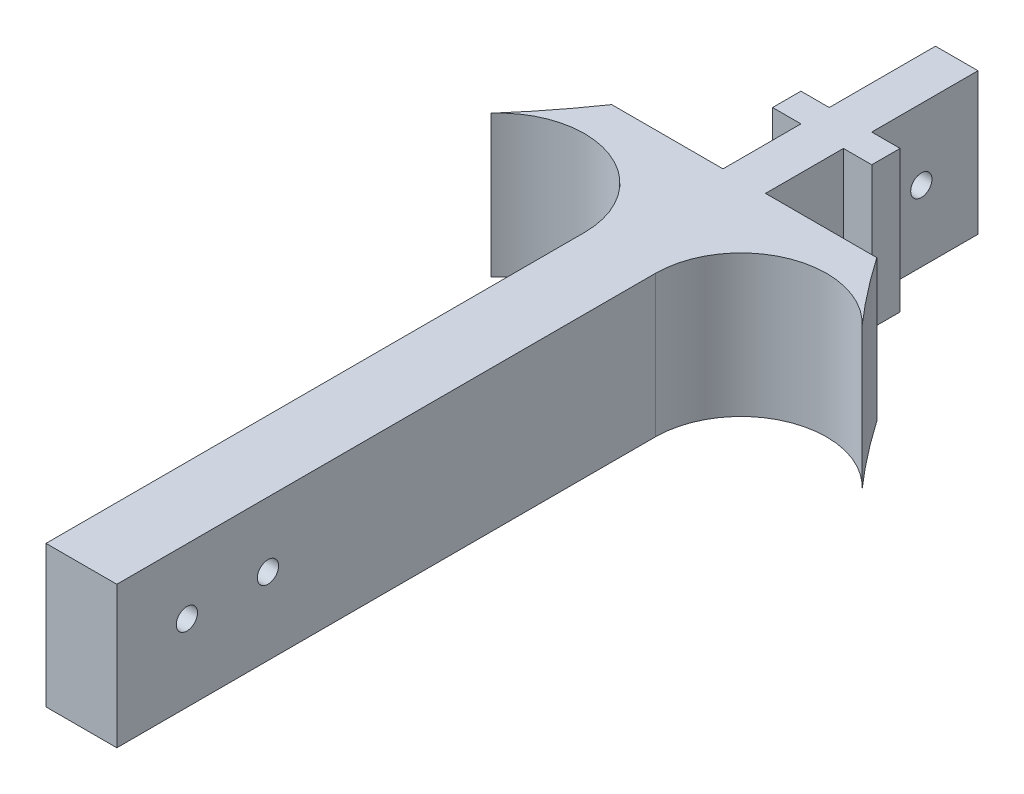
ISO-10303-21;
HEADER;
FILE_DESCRIPTION(('STEP AP214'),'2;1');
FILE_NAME('part.step','',(''),(''),'','','');
FILE_SCHEMA(('AUTOMOTIVE_DESIGN { 1 0 10303 214 1 1 1 1 }'));
ENDSEC;
DATA;
#1=APPLICATION_CONTEXT('core data for automotive mechanical design processes');
#2=APPLICATION_PROTOCOL_DEFINITION('international standard','automotive_design',2000,#1);
#3=PRODUCT_CONTEXT('',#1,'mechanical');
#4=PRODUCT('Part','Part','',(#3));
#5=PRODUCT_RELATED_PRODUCT_CATEGORY('part','',(#4));
#6=PRODUCT_DEFINITION_FORMATION('','',#4);
#7=PRODUCT_DEFINITION_CONTEXT('part definition',#1,'design');
#8=PRODUCT_DEFINITION('design','',#6,#7);
#9=PRODUCT_DEFINITION_SHAPE('','',#8);
#10=(LENGTH_UNIT() NAMED_UNIT(*) SI_UNIT(.MILLI.,.METRE.));
#11=(NAMED_UNIT(*) PLANE_ANGLE_UNIT() SI_UNIT($,.RADIAN.));
#12=(NAMED_UNIT(*) SI_UNIT($,.STERADIAN.) SOLID_ANGLE_UNIT());
#13=UNCERTAINTY_MEASURE_WITH_UNIT(LENGTH_MEASURE(1.E-05),#10,'distance_accuracy_value','');
#14=(GEOMETRIC_REPRESENTATION_CONTEXT(3) GLOBAL_UNCERTAINTY_ASSIGNED_CONTEXT((#13)) GLOBAL_UNIT_ASSIGNED_CONTEXT((#10,
#11,#12)) REPRESENTATION_CONTEXT('',''));
#15=CARTESIAN_POINT('',(0.,0.,0.));
#16=DIRECTION('',(0.,0.,1.));
#17=DIRECTION('',(1.,0.,0.));
#18=AXIS2_PLACEMENT_3D('',#15,#16,#17);
#19=CARTESIAN_POINT('',(-3.,20.,-84.398281038144));
#20=DIRECTION('',(0.,0.,1.));
#21=DIRECTION('',(1.,0.,0.));
#22=AXIS2_PLACEMENT_3D('',#19,#20,#21);
#23=PLANE('',#22);
#24=DIRECTION('',(-1.,0.,0.));
#25=VECTOR('',#24,1.);
#26=CARTESIAN_POINT('',(-3.,0.,-84.398281038144));
#27=LINE('',#26,#25);
#28=CARTESIAN_POINT('',(3.,0.,-84.398281038144));
#29=VERTEX_POINT('',#28);
#30=CARTESIAN_POINT('',(-3.,0.,-84.398281038144));
#31=VERTEX_POINT('',#30);
#32=EDGE_CURVE('E148',#29,#31,#27,.T.);
#33=ORIENTED_EDGE('',*,*,#32,.T.);
#34=DIRECTION('',(0.,-1.,0.));
#35=VECTOR('',#34,1.);
#36=CARTESIAN_POINT('',(-3.,20.,-84.398281038144));
#37=LINE('',#36,#35);
#38=CARTESIAN_POINT('',(-3.,20.,-84.398281038144));
#39=VERTEX_POINT('',#38);
#40=EDGE_CURVE('E11',#39,#31,#37,.T.);
#41=ORIENTED_EDGE('',*,*,#40,.F.);
#42=DIRECTION('',(-1.,0.,0.));
#43=VECTOR('',#42,1.);
#44=CARTESIAN_POINT('',(-3.,20.,-84.398281038144));
#45=LINE('',#44,#43);
#46=CARTESIAN_POINT('',(3.,20.,-84.398281038144));
#47=VERTEX_POINT('',#46);
#48=EDGE_CURVE('E170',#47,#39,#45,.T.);
#49=ORIENTED_EDGE('',*,*,#48,.F.);
#50=DIRECTION('',(0.,-1.,0.));
#51=VECTOR('',#50,1.);
#52=CARTESIAN_POINT('',(3.,20.,-84.398281038144));
#53=LINE('',#52,#51);
#54=EDGE_CURVE('E232',#47,#29,#53,.T.);
#55=ORIENTED_EDGE('',*,*,#54,.T.);
#56=EDGE_LOOP('',(#33,#41,#49,#55));
#57=FACE_BOUND('',#56,.T.);
#58=ADVANCED_FACE('F31',(#57),#23,.F.);
#59=CARTESIAN_POINT('',(-3.,20.,-84.398281038144));
#60=DIRECTION('',(1.,0.,0.));
#61=DIRECTION('',(0.,0.,-1.));
#62=AXIS2_PLACEMENT_3D('',#59,#60,#61);
#63=PLANE('',#62);
#64=CARTESIAN_POINT('',(-3.,10.,-76.398281038144));
#65=DIRECTION('',(-1.,0.,0.));
#66=DIRECTION('',(0.,0.,1.));
#67=AXIS2_PLACEMENT_3D('',#64,#65,#66);
#68=CIRCLE('',#67,1.5);
#69=CARTESIAN_POINT('',(-3.,10.,-74.898281038144));
#70=VERTEX_POINT('',#69);
#71=EDGE_CURVE('E190',#70,#70,#68,.T.);
#72=ORIENTED_EDGE('',*,*,#71,.F.);
#73=EDGE_LOOP('',(#72));
#74=FACE_BOUND('',#73,.T.);
#75=DIRECTION('',(0.,0.,1.));
#76=VECTOR('',#75,1.);
#77=CARTESIAN_POINT('',(-3.,0.,-84.398281038144));
#78=LINE('',#77,#76);
#79=CARTESIAN_POINT('',(-3.,0.,-69.398281038144));
#80=VERTEX_POINT('',#79);
#81=EDGE_CURVE('E151',#31,#80,#78,.T.);
#82=ORIENTED_EDGE('',*,*,#81,.T.);
#83=DIRECTION('',(0.,-1.,0.));
#84=VECTOR('',#83,1.);
#85=CARTESIAN_POINT('',(-3.,20.,-69.398281038144));
#86=LINE('',#85,#84);
#87=CARTESIAN_POINT('',(-3.,20.,-69.398281038144));
#88=VERTEX_POINT('',#87);
#89=EDGE_CURVE('E40',#88,#80,#86,.T.);
#90=ORIENTED_EDGE('',*,*,#89,.F.);
#91=DIRECTION('',(0.,0.,1.));
#92=VECTOR('',#91,1.);
#93=CARTESIAN_POINT('',(-3.,20.,-84.398281038144));
#94=LINE('',#93,#92);
#95=EDGE_CURVE('E99',#39,#88,#94,.T.);
#96=ORIENTED_EDGE('',*,*,#95,.F.);
#97=ORIENTED_EDGE('',*,*,#40,.T.);
#98=EDGE_LOOP('',(#82,#90,#96,#97));
#99=FACE_BOUND('',#98,.T.);
#100=ADVANCED_FACE('F376',(#74,#99),#63,.F.);
#101=CARTESIAN_POINT('',(-3.,20.,-69.398281038144));
#102=DIRECTION('',(0.,0.,1.));
#103=DIRECTION('',(1.,0.,0.));
#104=AXIS2_PLACEMENT_3D('',#101,#102,#103);
#105=PLANE('',#104);
#106=DIRECTION('',(-1.,0.,0.));
#107=VECTOR('',#106,1.);
#108=CARTESIAN_POINT('',(-3.,0.,-69.398281038144));
#109=LINE('',#108,#107);
#110=CARTESIAN_POINT('',(-7.,0.,-69.398281038144));
#111=VERTEX_POINT('',#110);
#112=EDGE_CURVE('E154',#80,#111,#109,.T.);
#113=ORIENTED_EDGE('',*,*,#112,.T.);
#114=DIRECTION('',(0.,-1.,0.));
#115=VECTOR('',#114,1.);
#116=CARTESIAN_POINT('',(-7.,20.,-69.398281038144));
#117=LINE('',#116,#115);
#118=CARTESIAN_POINT('',(-7.,20.,-69.398281038144));
#119=VERTEX_POINT('',#118);
#120=EDGE_CURVE('E183',#119,#111,#117,.T.);
#121=ORIENTED_EDGE('',*,*,#120,.F.);
#122=DIRECTION('',(-1.,0.,0.));
#123=VECTOR('',#122,1.);
#124=CARTESIAN_POINT('',(-3.,20.,-69.398281038144));
#125=LINE('',#124,#123);
#126=EDGE_CURVE('E286',#88,#119,#125,.T.);
#127=ORIENTED_EDGE('',*,*,#126,.F.);
#128=ORIENTED_EDGE('',*,*,#89,.T.);
#129=EDGE_LOOP('',(#113,#121,#127,#128));
#130=FACE_BOUND('',#129,.T.);
#131=ADVANCED_FACE('F380',(#130),#105,.F.);
#132=CARTESIAN_POINT('',(-7.,20.,-69.398281038144));
#133=DIRECTION('',(1.,0.,0.));
#134=DIRECTION('',(0.,0.,-1.));
#135=AXIS2_PLACEMENT_3D('',#132,#133,#134);
#136=PLANE('',#135);
#137=DIRECTION('',(0.,0.,1.));
#138=VECTOR('',#137,1.);
#139=CARTESIAN_POINT('',(-7.,0.,-69.398281038144));
#140=LINE('',#139,#138);
#141=CARTESIAN_POINT('',(-7.,0.,-65.398281038144));
#142=VERTEX_POINT('',#141);
#143=EDGE_CURVE('E156',#111,#142,#140,.T.);
#144=ORIENTED_EDGE('',*,*,#143,.T.);
#145=DIRECTION('',(0.,-1.,0.));
#146=VECTOR('',#145,1.);
#147=CARTESIAN_POINT('',(-7.,20.,-65.398281038144));
#148=LINE('',#147,#146);
#149=CARTESIAN_POINT('',(-7.,20.,-65.398281038144));
#150=VERTEX_POINT('',#149);
#151=EDGE_CURVE('E180',#150,#142,#148,.T.);
#152=ORIENTED_EDGE('',*,*,#151,.F.);
#153=DIRECTION('',(0.,0.,1.));
#154=VECTOR('',#153,1.);
#155=CARTESIAN_POINT('',(-7.,20.,-69.398281038144));
#156=LINE('',#155,#154);
#157=EDGE_CURVE('E288',#119,#150,#156,.T.);
#158=ORIENTED_EDGE('',*,*,#157,.F.);
#159=ORIENTED_EDGE('',*,*,#120,.T.);
#160=EDGE_LOOP('',(#144,#152,#158,#159));
#161=FACE_BOUND('',#160,.T.);
#162=ADVANCED_FACE('F385',(#161),#136,.F.);
#163=CARTESIAN_POINT('',(-3.,20.,-65.398281038144));
#164=DIRECTION('',(0.,0.,-1.));
#165=DIRECTION('',(-1.,0.,0.));
#166=AXIS2_PLACEMENT_3D('',#163,#164,#165);
#167=PLANE('',#166);
#168=DIRECTION('',(1.,0.,0.));
#169=VECTOR('',#168,1.);
#170=CARTESIAN_POINT('',(-3.,0.,-65.398281038144));
#171=LINE('',#170,#169);
#172=CARTESIAN_POINT('',(-3.,0.,-65.398281038144));
#173=VERTEX_POINT('',#172);
#174=EDGE_CURVE('E158',#142,#173,#171,.T.);
#175=ORIENTED_EDGE('',*,*,#174,.T.);
#176=DIRECTION('',(0.,-1.,0.));
#177=VECTOR('',#176,1.);
#178=CARTESIAN_POINT('',(-3.,20.,-65.398281038144));
#179=LINE('',#178,#177);
#180=CARTESIAN_POINT('',(-3.,20.,-65.398281038144));
#181=VERTEX_POINT('',#180);
#182=EDGE_CURVE('E177',#181,#173,#179,.T.);
#183=ORIENTED_EDGE('',*,*,#182,.F.);
#184=DIRECTION('',(1.,0.,0.));
#185=VECTOR('',#184,1.);
#186=CARTESIAN_POINT('',(-3.,20.,-65.398281038144));
#187=LINE('',#186,#185);
#188=EDGE_CURVE('E290',#150,#181,#187,.T.);
#189=ORIENTED_EDGE('',*,*,#188,.F.);
#190=ORIENTED_EDGE('',*,*,#151,.T.);
#191=EDGE_LOOP('',(#175,#183,#189,#190));
#192=FACE_BOUND('',#191,.T.);
#193=ADVANCED_FACE('F391',(#192),#167,.F.);
#194=CARTESIAN_POINT('',(-3.,20.,-65.398281038144));
#195=DIRECTION('',(1.,0.,0.));
#196=DIRECTION('',(0.,0.,-1.));
#197=AXIS2_PLACEMENT_3D('',#194,#195,#196);
#198=PLANE('',#197);
#199=CARTESIAN_POINT('',(-3.,10.,-60.398281038144));
#200=DIRECTION('',(-1.,0.,0.));
#201=DIRECTION('',(0.,0.,1.));
#202=AXIS2_PLACEMENT_3D('',#199,#200,#201);
#203=CIRCLE('',#202,1.5);
#204=CARTESIAN_POINT('',(-3.,10.,-58.898281038144));
#205=VERTEX_POINT('',#204);
#206=EDGE_CURVE('E201',#205,#205,#203,.T.);
#207=ORIENTED_EDGE('',*,*,#206,.F.);
#208=EDGE_LOOP('',(#207));
#209=FACE_BOUND('',#208,.T.);
#210=DIRECTION('',(0.,0.,1.));
#211=VECTOR('',#210,1.);
#212=CARTESIAN_POINT('',(-3.,0.,-65.398281038144));
#213=LINE('',#212,#211);
#214=CARTESIAN_POINT('',(-3.,0.,-54.398281038144));
#215=VERTEX_POINT('',#214);
#216=EDGE_CURVE('E160',#173,#215,#213,.T.);
#217=ORIENTED_EDGE('',*,*,#216,.T.);
#218=DIRECTION('',(0.,-1.,0.));
#219=VECTOR('',#218,1.);
#220=CARTESIAN_POINT('',(-3.,20.,-54.398281038144));
#221=LINE('',#220,#219);
#222=CARTESIAN_POINT('',(-3.,20.,-54.398281038144));
#223=VERTEX_POINT('',#222);
#224=EDGE_CURVE('E174',#223,#215,#221,.T.);
#225=ORIENTED_EDGE('',*,*,#224,.F.);
#226=DIRECTION('',(0.,0.,1.));
#227=VECTOR('',#226,1.);
#228=CARTESIAN_POINT('',(-3.,20.,-65.398281038144));
#229=LINE('',#228,#227);
#230=EDGE_CURVE('E292',#181,#223,#229,.T.);
#231=ORIENTED_EDGE('',*,*,#230,.F.);
#232=ORIENTED_EDGE('',*,*,#182,.T.);
#233=EDGE_LOOP('',(#217,#225,#231,#232));
#234=FACE_BOUND('',#233,.T.);
#235=ADVANCED_FACE('F298',(#209,#234),#198,.F.);
#236=CARTESIAN_POINT('',(-3.,20.,-54.398281038144));
#237=DIRECTION('',(0.,0.,1.));
#238=DIRECTION('',(1.,0.,0.));
#239=AXIS2_PLACEMENT_3D('',#236,#237,#238);
#240=PLANE('',#239);
#241=DIRECTION('',(-1.,0.,0.));
#242=VECTOR('',#241,1.);
#243=CARTESIAN_POINT('',(-3.,0.,-54.398281038144));
#244=LINE('',#243,#242);
#245=CARTESIAN_POINT('',(-18.71,0.,-54.398281038144));
#246=VERTEX_POINT('',#245);
#247=EDGE_CURVE('E162',#215,#246,#244,.T.);
#248=ORIENTED_EDGE('',*,*,#247,.T.);
#249=DIRECTION('',(0.,-1.,0.));
#250=VECTOR('',#249,1.);
#251=CARTESIAN_POINT('',(-18.71,20.,-54.398281038144));
#252=LINE('',#251,#250);
#253=CARTESIAN_POINT('',(-18.71,20.,-54.398281038144));
#254=VERTEX_POINT('',#253);
#255=EDGE_CURVE('E137',#254,#246,#252,.T.);
#256=ORIENTED_EDGE('',*,*,#255,.F.);
#257=DIRECTION('',(-1.,0.,0.));
#258=VECTOR('',#257,1.);
#259=CARTESIAN_POINT('',(-3.,20.,-54.398281038144));
#260=LINE('',#259,#258);
#261=EDGE_CURVE('E128',#223,#254,#260,.T.);
#262=ORIENTED_EDGE('',*,*,#261,.F.);
#263=ORIENTED_EDGE('',*,*,#224,.T.);
#264=EDGE_LOOP('',(#248,#256,#262,#263));
#265=FACE_BOUND('',#264,.T.);
#266=ADVANCED_FACE('F302',(#265),#240,.F.);
#267=CARTESIAN_POINT('',(-105.5,20.,-114.379493930182));
#268=DIRECTION('',(0.,-1.,0.));
#269=DIRECTION('',(0.,0.,-1.));
#270=AXIS2_PLACEMENT_3D('',#267,#268,#269);
#271=CYLINDRICAL_SURFACE('',#270,105.5);
#272=CARTESIAN_POINT('',(-105.5,0.,-114.379493930182));
#273=DIRECTION('',(0.,-1.,0.));
#274=DIRECTION('',(0.,0.,1.));
#275=AXIS2_PLACEMENT_3D('',#272,#273,#274);
#276=CIRCLE('',#275,105.5);
#277=CARTESIAN_POINT('',(-26.1833299524756,0.,-44.8157400595625));
#278=VERTEX_POINT('',#277);
#279=EDGE_CURVE('E136',#246,#278,#276,.T.);
#280=ORIENTED_EDGE('',*,*,#279,.T.);
#281=DIRECTION('',(0.,-1.,0.));
#282=VECTOR('',#281,1.);
#283=CARTESIAN_POINT('',(-26.1833299524756,20.,-44.8157400595625));
#284=LINE('',#283,#282);
#285=CARTESIAN_POINT('',(-26.1833299524756,20.,-44.8157400595625));
#286=VERTEX_POINT('',#285);
#287=EDGE_CURVE('E133',#286,#278,#284,.T.);
#288=ORIENTED_EDGE('',*,*,#287,.F.);
#289=CARTESIAN_POINT('',(-105.5,20.,-114.379493930182));
#290=DIRECTION('',(0.,-1.,0.));
#291=DIRECTION('',(0.,0.,1.));
#292=AXIS2_PLACEMENT_3D('',#289,#290,#291);
#293=CIRCLE('',#292,105.5);
#294=EDGE_CURVE('E122',#254,#286,#293,.T.);
#295=ORIENTED_EDGE('',*,*,#294,.F.);
#296=ORIENTED_EDGE('',*,*,#255,.T.);
#297=EDGE_LOOP('',(#280,#288,#295,#296));
#298=FACE_BOUND('',#297,.T.);
#299=ADVANCED_FACE('F134',(#298),#271,.F.);
#300=CARTESIAN_POINT('',(-17.0922063437865,20.,-36.8424768761321));
#301=DIRECTION('',(0.,-1.,0.));
#302=DIRECTION('',(0.,0.,-1.));
#303=AXIS2_PLACEMENT_3D('',#300,#301,#302);
#304=CYLINDRICAL_SURFACE('',#303,12.0922063437865);
#305=CARTESIAN_POINT('',(-17.0922063437865,0.,-36.8424768761321));
#306=DIRECTION('',(0.,-1.,0.));
#307=DIRECTION('',(0.,0.,1.));
#308=AXIS2_PLACEMENT_3D('',#305,#306,#307);
#309=CIRCLE('',#308,12.0922063437865);
#310=CARTESIAN_POINT('',(-4.99999999999998,0.,-36.8424768761321));
#311=VERTEX_POINT('',#310);
#312=EDGE_CURVE('E85',#278,#311,#309,.T.);
#313=ORIENTED_EDGE('',*,*,#312,.T.);
#314=DIRECTION('',(0.,-1.,0.));
#315=VECTOR('',#314,1.);
#316=CARTESIAN_POINT('',(-4.99999999999998,20.,-36.8424768761321));
#317=LINE('',#316,#315);
#318=CARTESIAN_POINT('',(-4.99999999999998,20.,-36.8424768761321));
#319=VERTEX_POINT('',#318);
#320=EDGE_CURVE('E138',#319,#311,#317,.T.);
#321=ORIENTED_EDGE('',*,*,#320,.F.);
#322=CARTESIAN_POINT('',(-17.0922063437865,20.,-36.8424768761321));
#323=DIRECTION('',(0.,-1.,0.));
#324=DIRECTION('',(0.,0.,1.));
#325=AXIS2_PLACEMENT_3D('',#322,#323,#324);
#326=CIRCLE('',#325,12.0922063437865);
#327=EDGE_CURVE('E126',#286,#319,#326,.T.);
#328=ORIENTED_EDGE('',*,*,#327,.F.);
#329=ORIENTED_EDGE('',*,*,#287,.T.);
#330=EDGE_LOOP('',(#313,#321,#328,#329));
#331=FACE_BOUND('',#330,.T.);
#332=ADVANCED_FACE('F140',(#331),#304,.F.);
#333=CARTESIAN_POINT('',(-4.99999999999998,20.,-36.8424768761321));
#334=DIRECTION('',(1.,0.,0.));
#335=DIRECTION('',(0.,0.,-1.));
#336=AXIS2_PLACEMENT_3D('',#333,#334,#335);
#337=PLANE('',#336);
#338=CARTESIAN_POINT('',(-4.99999999999999,10.84,17.8419758746343));
#339=DIRECTION('',(-1.,0.,0.));
#340=DIRECTION('',(0.,0.,1.));
#341=AXIS2_PLACEMENT_3D('',#338,#339,#340);
#342=CIRCLE('',#341,1.5);
#343=CARTESIAN_POINT('',(-4.99999999999999,10.84,19.3419758746343));
#344=VERTEX_POINT('',#343);
#345=EDGE_CURVE('E563',#344,#344,#342,.T.);
#346=ORIENTED_EDGE('',*,*,#345,.F.);
#347=EDGE_LOOP('',(#346));
#348=FACE_BOUND('',#347,.T.);
#349=CARTESIAN_POINT('',(-4.99999999999999,10.84,29.2919758746343));
#350=DIRECTION('',(-1.,0.,0.));
#351=DIRECTION('',(0.,0.,1.));
#352=AXIS2_PLACEMENT_3D('',#349,#350,#351);
#353=CIRCLE('',#352,1.5);
#354=CARTESIAN_POINT('',(-4.99999999999999,10.84,30.7919758746343));
#355=VERTEX_POINT('',#354);
#356=EDGE_CURVE('E565',#355,#355,#353,.T.);
#357=ORIENTED_EDGE('',*,*,#356,.F.);
#358=EDGE_LOOP('',(#357));
#359=FACE_BOUND('',#358,.T.);
#360=DIRECTION('',(0.,0.,1.));
#361=VECTOR('',#360,1.);
#362=CARTESIAN_POINT('',(-4.99999999999998,0.,-36.8424768761321));
#363=LINE('',#362,#361);
#364=CARTESIAN_POINT('',(-4.99999999999998,0.,39.1827395865434));
#365=VERTEX_POINT('',#364);
#366=EDGE_CURVE('E91',#311,#365,#363,.T.);
#367=ORIENTED_EDGE('',*,*,#366,.T.);
#368=DIRECTION('',(0.,-1.,0.));
#369=VECTOR('',#368,1.);
#370=CARTESIAN_POINT('',(-4.99999999999998,20.,39.1827395865434));
#371=LINE('',#370,#369);
#372=CARTESIAN_POINT('',(-4.99999999999998,20.,39.1827395865434));
#373=VERTEX_POINT('',#372);
#374=EDGE_CURVE('E147',#373,#365,#371,.T.);
#375=ORIENTED_EDGE('',*,*,#374,.F.);
#376=DIRECTION('',(0.,0.,1.));
#377=VECTOR('',#376,1.);
#378=CARTESIAN_POINT('',(-4.99999999999998,20.,-36.8424768761321));
#379=LINE('',#378,#377);
#380=EDGE_CURVE('E49',#319,#373,#379,.T.);
#381=ORIENTED_EDGE('',*,*,#380,.F.);
#382=ORIENTED_EDGE('',*,*,#320,.T.);
#383=EDGE_LOOP('',(#367,#375,#381,#382));
#384=FACE_BOUND('',#383,.T.);
#385=ADVANCED_FACE('F405',(#348,#359,#384),#337,.F.);
#386=CARTESIAN_POINT('',(-4.99999999999998,20.,39.1827395865434));
#387=DIRECTION('',(0.,0.,-1.));
#388=DIRECTION('',(-1.,0.,0.));
#389=AXIS2_PLACEMENT_3D('',#386,#387,#388);
#390=PLANE('',#389);
#391=DIRECTION('',(1.,0.,0.));
#392=VECTOR('',#391,1.);
#393=CARTESIAN_POINT('',(-4.99999999999998,0.,39.1827395865434));
#394=LINE('',#393,#392);
#395=CARTESIAN_POINT('',(4.99999999999998,0.,39.1827395865434));
#396=VERTEX_POINT('',#395);
#397=EDGE_CURVE('E167',#365,#396,#394,.T.);
#398=ORIENTED_EDGE('',*,*,#397,.T.);
#399=DIRECTION('',(0.,-1.,0.));
#400=VECTOR('',#399,1.);
#401=CARTESIAN_POINT('',(4.99999999999998,20.,39.1827395865434));
#402=LINE('',#401,#400);
#403=CARTESIAN_POINT('',(4.99999999999998,20.,39.1827395865434));
#404=VERTEX_POINT('',#403);
#405=EDGE_CURVE('E152',#404,#396,#402,.T.);
#406=ORIENTED_EDGE('',*,*,#405,.F.);
#407=DIRECTION('',(1.,0.,0.));
#408=VECTOR('',#407,1.);
#409=CARTESIAN_POINT('',(-4.99999999999998,20.,39.1827395865434));
#410=LINE('',#409,#408);
#411=EDGE_CURVE('E142',#373,#404,#410,.T.);
#412=ORIENTED_EDGE('',*,*,#411,.F.);
#413=ORIENTED_EDGE('',*,*,#374,.T.);
#414=EDGE_LOOP('',(#398,#406,#412,#413));
#415=FACE_BOUND('',#414,.T.);
#416=ADVANCED_FACE('F311',(#415),#390,.F.);
#417=CARTESIAN_POINT('',(-17.0922063437865,20.,-36.8424768761321));
#418=DIRECTION('',(0.,1.,0.));
#419=DIRECTION('',(0.,0.,1.));
#420=AXIS2_PLACEMENT_3D('',#417,#418,#419);
#421=PLANE('',#420);
#422=ORIENTED_EDGE('',*,*,#48,.T.);
#423=ORIENTED_EDGE('',*,*,#95,.T.);
#424=ORIENTED_EDGE('',*,*,#126,.T.);
#425=ORIENTED_EDGE('',*,*,#157,.T.);
#426=ORIENTED_EDGE('',*,*,#188,.T.);
#427=ORIENTED_EDGE('',*,*,#230,.T.);
#428=ORIENTED_EDGE('',*,*,#261,.T.);
#429=ORIENTED_EDGE('',*,*,#294,.T.);
#430=ORIENTED_EDGE('',*,*,#327,.T.);
#431=ORIENTED_EDGE('',*,*,#380,.T.);
#432=ORIENTED_EDGE('',*,*,#411,.T.);
#433=DIRECTION('',(0.,0.,1.));
#434=VECTOR('',#433,1.);
#435=CARTESIAN_POINT('',(4.99999999999998,20.,-36.8424768761321));
#436=LINE('',#435,#434);
#437=CARTESIAN_POINT('',(4.99999999999998,20.,-36.8424768761321));
#438=VERTEX_POINT('',#437);
#439=EDGE_CURVE('E205',#438,#404,#436,.T.);
#440=ORIENTED_EDGE('',*,*,#439,.F.);
#441=CARTESIAN_POINT('',(17.0922063437865,20.,-36.8424768761321));
#442=DIRECTION('',(0.,1.,0.));
#443=DIRECTION('',(0.,0.,1.));
#444=AXIS2_PLACEMENT_3D('',#441,#442,#443);
#445=CIRCLE('',#444,12.0922063437865);
#446=CARTESIAN_POINT('',(26.1833299524756,20.,-44.8157400595625));
#447=VERTEX_POINT('',#446);
#448=EDGE_CURVE('E208',#447,#438,#445,.T.);
#449=ORIENTED_EDGE('',*,*,#448,.F.);
#450=CARTESIAN_POINT('',(105.5,20.,-114.379493930182));
#451=DIRECTION('',(0.,1.,0.));
#452=DIRECTION('',(0.,0.,1.));
#453=AXIS2_PLACEMENT_3D('',#450,#451,#452);
#454=CIRCLE('',#453,105.5);
#455=CARTESIAN_POINT('',(18.71,20.,-54.398281038144));
#456=VERTEX_POINT('',#455);
#457=EDGE_CURVE('E212',#456,#447,#454,.T.);
#458=ORIENTED_EDGE('',*,*,#457,.F.);
#459=DIRECTION('',(1.,0.,0.));
#460=VECTOR('',#459,1.);
#461=CARTESIAN_POINT('',(3.,20.,-54.398281038144));
#462=LINE('',#461,#460);
#463=CARTESIAN_POINT('',(3.,20.,-54.398281038144));
#464=VERTEX_POINT('',#463);
#465=EDGE_CURVE('E215',#464,#456,#462,.T.);
#466=ORIENTED_EDGE('',*,*,#465,.F.);
#467=DIRECTION('',(0.,0.,1.));
#468=VECTOR('',#467,1.);
#469=CARTESIAN_POINT('',(3.,20.,-65.398281038144));
#470=LINE('',#469,#468);
#471=CARTESIAN_POINT('',(3.,20.,-65.398281038144));
#472=VERTEX_POINT('',#471);
#473=EDGE_CURVE('E218',#472,#464,#470,.T.);
#474=ORIENTED_EDGE('',*,*,#473,.F.);
#475=DIRECTION('',(-1.,0.,0.));
#476=VECTOR('',#475,1.);
#477=CARTESIAN_POINT('',(3.,20.,-65.398281038144));
#478=LINE('',#477,#476);
#479=CARTESIAN_POINT('',(7.,20.,-65.398281038144));
#480=VERTEX_POINT('',#479);
#481=EDGE_CURVE('E221',#480,#472,#478,.T.);
#482=ORIENTED_EDGE('',*,*,#481,.F.);
#483=DIRECTION('',(0.,0.,1.));
#484=VECTOR('',#483,1.);
#485=CARTESIAN_POINT('',(7.,20.,-69.398281038144));
#486=LINE('',#485,#484);
#487=CARTESIAN_POINT('',(7.,20.,-69.398281038144));
#488=VERTEX_POINT('',#487);
#489=EDGE_CURVE('E224',#488,#480,#486,.T.);
#490=ORIENTED_EDGE('',*,*,#489,.F.);
#491=DIRECTION('',(1.,0.,0.));
#492=VECTOR('',#491,1.);
#493=CARTESIAN_POINT('',(3.,20.,-69.398281038144));
#494=LINE('',#493,#492);
#495=CARTESIAN_POINT('',(3.,20.,-69.398281038144));
#496=VERTEX_POINT('',#495);
#497=EDGE_CURVE('E227',#496,#488,#494,.T.);
#498=ORIENTED_EDGE('',*,*,#497,.F.);
#499=DIRECTION('',(0.,0.,1.));
#500=VECTOR('',#499,1.);
#501=CARTESIAN_POINT('',(3.,20.,-84.398281038144));
#502=LINE('',#501,#500);
#503=EDGE_CURVE('E230',#47,#496,#502,.T.);
#504=ORIENTED_EDGE('',*,*,#503,.F.);
#505=EDGE_LOOP('',(#422,#423,#424,#425,#426,#427,#428,#429,#430,#431,#432,#440,#449,#458,#466,
#474,#482,#490,#498,#504));
#506=FACE_BOUND('',#505,.T.);
#507=ADVANCED_FACE('F124',(#506),#421,.T.);
#508=CARTESIAN_POINT('',(-17.0922063437865,0.,-36.8424768761321));
#509=DIRECTION('',(0.,1.,0.));
#510=DIRECTION('',(0.,0.,1.));
#511=AXIS2_PLACEMENT_3D('',#508,#509,#510);
#512=PLANE('',#511);
#513=ORIENTED_EDGE('',*,*,#32,.F.);
#514=DIRECTION('',(0.,0.,1.));
#515=VECTOR('',#514,1.);
#516=CARTESIAN_POINT('',(3.,0.,-84.398281038144));
#517=LINE('',#516,#515);
#518=CARTESIAN_POINT('',(3.,0.,-69.398281038144));
#519=VERTEX_POINT('',#518);
#520=EDGE_CURVE('E209',#29,#519,#517,.T.);
#521=ORIENTED_EDGE('',*,*,#520,.T.);
#522=DIRECTION('',(1.,0.,0.));
#523=VECTOR('',#522,1.);
#524=CARTESIAN_POINT('',(3.,0.,-69.398281038144));
#525=LINE('',#524,#523);
#526=CARTESIAN_POINT('',(7.,0.,-69.398281038144));
#527=VERTEX_POINT('',#526);
#528=EDGE_CURVE('E251',#519,#527,#525,.T.);
#529=ORIENTED_EDGE('',*,*,#528,.T.);
#530=DIRECTION('',(0.,0.,1.));
#531=VECTOR('',#530,1.);
#532=CARTESIAN_POINT('',(7.,0.,-69.398281038144));
#533=LINE('',#532,#531);
#534=CARTESIAN_POINT('',(7.,0.,-65.398281038144));
#535=VERTEX_POINT('',#534);
#536=EDGE_CURVE('E248',#527,#535,#533,.T.);
#537=ORIENTED_EDGE('',*,*,#536,.T.);
#538=DIRECTION('',(-1.,0.,0.));
#539=VECTOR('',#538,1.);
#540=CARTESIAN_POINT('',(3.,0.,-65.398281038144));
#541=LINE('',#540,#539);
#542=CARTESIAN_POINT('',(3.,0.,-65.398281038144));
#543=VERTEX_POINT('',#542);
#544=EDGE_CURVE('E245',#535,#543,#541,.T.);
#545=ORIENTED_EDGE('',*,*,#544,.T.);
#546=DIRECTION('',(0.,0.,1.));
#547=VECTOR('',#546,1.);
#548=CARTESIAN_POINT('',(3.,0.,-65.398281038144));
#549=LINE('',#548,#547);
#550=CARTESIAN_POINT('',(3.,0.,-54.398281038144));
#551=VERTEX_POINT('',#550);
#552=EDGE_CURVE('E242',#543,#551,#549,.T.);
#553=ORIENTED_EDGE('',*,*,#552,.T.);
#554=DIRECTION('',(1.,0.,0.));
#555=VECTOR('',#554,1.);
#556=CARTESIAN_POINT('',(3.,0.,-54.398281038144));
#557=LINE('',#556,#555);
#558=CARTESIAN_POINT('',(18.71,0.,-54.398281038144));
#559=VERTEX_POINT('',#558);
#560=EDGE_CURVE('E239',#551,#559,#557,.T.);
#561=ORIENTED_EDGE('',*,*,#560,.T.);
#562=CARTESIAN_POINT('',(105.5,0.,-114.379493930182));
#563=DIRECTION('',(0.,1.,0.));
#564=DIRECTION('',(0.,0.,1.));
#565=AXIS2_PLACEMENT_3D('',#562,#563,#564);
#566=CIRCLE('',#565,105.5);
#567=CARTESIAN_POINT('',(26.1833299524756,0.,-44.8157400595625));
#568=VERTEX_POINT('',#567);
#569=EDGE_CURVE('E236',#559,#568,#566,.T.);
#570=ORIENTED_EDGE('',*,*,#569,.T.);
#571=CARTESIAN_POINT('',(17.0922063437865,0.,-36.8424768761321));
#572=DIRECTION('',(0.,1.,0.));
#573=DIRECTION('',(0.,0.,1.));
#574=AXIS2_PLACEMENT_3D('',#571,#572,#573);
#575=CIRCLE('',#574,12.0922063437865);
#576=CARTESIAN_POINT('',(4.99999999999998,0.,-36.8424768761321));
#577=VERTEX_POINT('',#576);
#578=EDGE_CURVE('E194',#568,#577,#575,.T.);
#579=ORIENTED_EDGE('',*,*,#578,.T.);
#580=DIRECTION('',(0.,0.,1.));
#581=VECTOR('',#580,1.);
#582=CARTESIAN_POINT('',(4.99999999999998,0.,-36.8424768761321));
#583=LINE('',#582,#581);
#584=EDGE_CURVE('E189',#577,#396,#583,.T.);
#585=ORIENTED_EDGE('',*,*,#584,.T.);
#586=ORIENTED_EDGE('',*,*,#397,.F.);
#587=ORIENTED_EDGE('',*,*,#366,.F.);
#588=ORIENTED_EDGE('',*,*,#312,.F.);
#589=ORIENTED_EDGE('',*,*,#279,.F.);
#590=ORIENTED_EDGE('',*,*,#247,.F.);
#591=ORIENTED_EDGE('',*,*,#216,.F.);
#592=ORIENTED_EDGE('',*,*,#174,.F.);
#593=ORIENTED_EDGE('',*,*,#143,.F.);
#594=ORIENTED_EDGE('',*,*,#112,.F.);
#595=ORIENTED_EDGE('',*,*,#81,.F.);
#596=EDGE_LOOP('',(#513,#521,#529,#537,#545,#553,#561,#570,#579,#585,#586,#587,#588,#589,#590,
#591,#592,#593,#594,#595));
#597=FACE_BOUND('',#596,.T.);
#598=ADVANCED_FACE('F305',(#597),#512,.F.);
#599=CARTESIAN_POINT('',(4.99999999999998,20.,-36.8424768761321));
#600=DIRECTION('',(1.,0.,0.));
#601=DIRECTION('',(0.,0.,-1.));
#602=AXIS2_PLACEMENT_3D('',#599,#600,#601);
#603=PLANE('',#602);
#604=CARTESIAN_POINT('',(5.00000000000001,10.84,17.8419758746343));
#605=DIRECTION('',(-1.,0.,0.));
#606=DIRECTION('',(0.,0.,1.));
#607=AXIS2_PLACEMENT_3D('',#604,#605,#606);
#608=CIRCLE('',#607,1.5);
#609=CARTESIAN_POINT('',(5.00000000000001,10.84,19.3419758746343));
#610=VERTEX_POINT('',#609);
#611=EDGE_CURVE('E560',#610,#610,#608,.T.);
#612=ORIENTED_EDGE('',*,*,#611,.T.);
#613=EDGE_LOOP('',(#612));
#614=FACE_BOUND('',#613,.T.);
#615=CARTESIAN_POINT('',(5.00000000000001,10.84,29.2919758746343));
#616=DIRECTION('',(-1.,0.,0.));
#617=DIRECTION('',(0.,0.,1.));
#618=AXIS2_PLACEMENT_3D('',#615,#616,#617);
#619=CIRCLE('',#618,1.5);
#620=CARTESIAN_POINT('',(5.00000000000001,10.84,30.7919758746343));
#621=VERTEX_POINT('',#620);
#622=EDGE_CURVE('E568',#621,#621,#619,.T.);
#623=ORIENTED_EDGE('',*,*,#622,.T.);
#624=EDGE_LOOP('',(#623));
#625=FACE_BOUND('',#624,.T.);
#626=ORIENTED_EDGE('',*,*,#584,.F.);
#627=DIRECTION('',(0.,-1.,0.));
#628=VECTOR('',#627,1.);
#629=CARTESIAN_POINT('',(4.99999999999998,20.,-36.8424768761321));
#630=LINE('',#629,#628);
#631=EDGE_CURVE('E279',#438,#577,#630,.T.);
#632=ORIENTED_EDGE('',*,*,#631,.F.);
#633=ORIENTED_EDGE('',*,*,#439,.T.);
#634=ORIENTED_EDGE('',*,*,#405,.T.);
#635=EDGE_LOOP('',(#626,#632,#633,#634));
#636=FACE_BOUND('',#635,.T.);
#637=ADVANCED_FACE('F317',(#614,#625,#636),#603,.T.);
#638=CARTESIAN_POINT('',(17.0922063437865,20.,-36.8424768761321));
#639=DIRECTION('',(0.,-1.,0.));
#640=DIRECTION('',(0.,0.,-1.));
#641=AXIS2_PLACEMENT_3D('',#638,#639,#640);
#642=CYLINDRICAL_SURFACE('',#641,12.0922063437865);
#643=ORIENTED_EDGE('',*,*,#578,.F.);
#644=DIRECTION('',(0.,-1.,0.));
#645=VECTOR('',#644,1.);
#646=CARTESIAN_POINT('',(26.1833299524756,20.,-44.8157400595625));
#647=LINE('',#646,#645);
#648=EDGE_CURVE('E276',#447,#568,#647,.T.);
#649=ORIENTED_EDGE('',*,*,#648,.F.);
#650=ORIENTED_EDGE('',*,*,#448,.T.);
#651=ORIENTED_EDGE('',*,*,#631,.T.);
#652=EDGE_LOOP('',(#643,#649,#650,#651));
#653=FACE_BOUND('',#652,.T.);
#654=ADVANCED_FACE('F329',(#653),#642,.F.);
#655=CARTESIAN_POINT('',(105.5,20.,-114.379493930182));
#656=DIRECTION('',(0.,-1.,0.));
#657=DIRECTION('',(0.,0.,-1.));
#658=AXIS2_PLACEMENT_3D('',#655,#656,#657);
#659=CYLINDRICAL_SURFACE('',#658,105.5);
#660=ORIENTED_EDGE('',*,*,#569,.F.);
#661=DIRECTION('',(0.,-1.,0.));
#662=VECTOR('',#661,1.);
#663=CARTESIAN_POINT('',(18.71,20.,-54.398281038144));
#664=LINE('',#663,#662);
#665=EDGE_CURVE('E273',#456,#559,#664,.T.);
#666=ORIENTED_EDGE('',*,*,#665,.F.);
#667=ORIENTED_EDGE('',*,*,#457,.T.);
#668=ORIENTED_EDGE('',*,*,#648,.T.);
#669=EDGE_LOOP('',(#660,#666,#667,#668));
#670=FACE_BOUND('',#669,.T.);
#671=ADVANCED_FACE('F335',(#670),#659,.F.);
#672=CARTESIAN_POINT('',(3.,20.,-54.398281038144));
#673=DIRECTION('',(0.,0.,-1.));
#674=DIRECTION('',(-1.,0.,0.));
#675=AXIS2_PLACEMENT_3D('',#672,#673,#674);
#676=PLANE('',#675);
#677=ORIENTED_EDGE('',*,*,#560,.F.);
#678=DIRECTION('',(0.,-1.,0.));
#679=VECTOR('',#678,1.);
#680=CARTESIAN_POINT('',(3.,20.,-54.398281038144));
#681=LINE('',#680,#679);
#682=EDGE_CURVE('E270',#464,#551,#681,.T.);
#683=ORIENTED_EDGE('',*,*,#682,.F.);
#684=ORIENTED_EDGE('',*,*,#465,.T.);
#685=ORIENTED_EDGE('',*,*,#665,.T.);
#686=EDGE_LOOP('',(#677,#683,#684,#685));
#687=FACE_BOUND('',#686,.T.);
#688=ADVANCED_FACE('F422',(#687),#676,.T.);
#689=CARTESIAN_POINT('',(3.,20.,-65.398281038144));
#690=DIRECTION('',(1.,0.,0.));
#691=DIRECTION('',(0.,0.,-1.));
#692=AXIS2_PLACEMENT_3D('',#689,#690,#691);
#693=PLANE('',#692);
#694=CARTESIAN_POINT('',(3.,10.,-60.398281038144));
#695=DIRECTION('',(1.,0.,0.));
#696=DIRECTION('',(0.,0.,-1.));
#697=AXIS2_PLACEMENT_3D('',#694,#695,#696);
#698=CIRCLE('',#697,1.5);
#699=CARTESIAN_POINT('',(3.,10.,-61.898281038144));
#700=VERTEX_POINT('',#699);
#701=EDGE_CURVE('E34',#700,#700,#698,.T.);
#702=ORIENTED_EDGE('',*,*,#701,.F.);
#703=EDGE_LOOP('',(#702));
#704=FACE_BOUND('',#703,.T.);
#705=ORIENTED_EDGE('',*,*,#552,.F.);
#706=DIRECTION('',(0.,-1.,0.));
#707=VECTOR('',#706,1.);
#708=CARTESIAN_POINT('',(3.,20.,-65.398281038144));
#709=LINE('',#708,#707);
#710=EDGE_CURVE('E267',#472,#543,#709,.T.);
#711=ORIENTED_EDGE('',*,*,#710,.F.);
#712=ORIENTED_EDGE('',*,*,#473,.T.);
#713=ORIENTED_EDGE('',*,*,#682,.T.);
#714=EDGE_LOOP('',(#705,#711,#712,#713));
#715=FACE_BOUND('',#714,.T.);
#716=ADVANCED_FACE('F425',(#704,#715),#693,.T.);
#717=CARTESIAN_POINT('',(3.,20.,-65.398281038144));
#718=DIRECTION('',(0.,0.,1.));
#719=DIRECTION('',(1.,0.,0.));
#720=AXIS2_PLACEMENT_3D('',#717,#718,#719);
#721=PLANE('',#720);
#722=ORIENTED_EDGE('',*,*,#544,.F.);
#723=DIRECTION('',(0.,-1.,0.));
#724=VECTOR('',#723,1.);
#725=CARTESIAN_POINT('',(7.,20.,-65.398281038144));
#726=LINE('',#725,#724);
#727=EDGE_CURVE('E264',#480,#535,#726,.T.);
#728=ORIENTED_EDGE('',*,*,#727,.F.);
#729=ORIENTED_EDGE('',*,*,#481,.T.);
#730=ORIENTED_EDGE('',*,*,#710,.T.);
#731=EDGE_LOOP('',(#722,#728,#729,#730));
#732=FACE_BOUND('',#731,.T.);
#733=ADVANCED_FACE('F429',(#732),#721,.T.);
#734=CARTESIAN_POINT('',(7.,20.,-69.398281038144));
#735=DIRECTION('',(1.,0.,0.));
#736=DIRECTION('',(0.,0.,-1.));
#737=AXIS2_PLACEMENT_3D('',#734,#735,#736);
#738=PLANE('',#737);
#739=ORIENTED_EDGE('',*,*,#536,.F.);
#740=DIRECTION('',(0.,-1.,0.));
#741=VECTOR('',#740,1.);
#742=CARTESIAN_POINT('',(7.,20.,-69.398281038144));
#743=LINE('',#742,#741);
#744=EDGE_CURVE('E261',#488,#527,#743,.T.);
#745=ORIENTED_EDGE('',*,*,#744,.F.);
#746=ORIENTED_EDGE('',*,*,#489,.T.);
#747=ORIENTED_EDGE('',*,*,#727,.T.);
#748=EDGE_LOOP('',(#739,#745,#746,#747));
#749=FACE_BOUND('',#748,.T.);
#750=ADVANCED_FACE('F372',(#749),#738,.T.);
#751=CARTESIAN_POINT('',(3.,20.,-69.398281038144));
#752=DIRECTION('',(0.,0.,-1.));
#753=DIRECTION('',(-1.,0.,0.));
#754=AXIS2_PLACEMENT_3D('',#751,#752,#753);
#755=PLANE('',#754);
#756=ORIENTED_EDGE('',*,*,#528,.F.);
#757=DIRECTION('',(0.,-1.,0.));
#758=VECTOR('',#757,1.);
#759=CARTESIAN_POINT('',(3.,20.,-69.398281038144));
#760=LINE('',#759,#758);
#761=EDGE_CURVE('E258',#496,#519,#760,.T.);
#762=ORIENTED_EDGE('',*,*,#761,.F.);
#763=ORIENTED_EDGE('',*,*,#497,.T.);
#764=ORIENTED_EDGE('',*,*,#744,.T.);
#765=EDGE_LOOP('',(#756,#762,#763,#764));
#766=FACE_BOUND('',#765,.T.);
#767=ADVANCED_FACE('F363',(#766),#755,.T.);
#768=CARTESIAN_POINT('',(3.,20.,-84.398281038144));
#769=DIRECTION('',(1.,0.,0.));
#770=DIRECTION('',(0.,0.,-1.));
#771=AXIS2_PLACEMENT_3D('',#768,#769,#770);
#772=PLANE('',#771);
#773=CARTESIAN_POINT('',(3.,10.,-76.398281038144));
#774=DIRECTION('',(1.,0.,0.));
#775=DIRECTION('',(0.,0.,-1.));
#776=AXIS2_PLACEMENT_3D('',#773,#774,#775);
#777=CIRCLE('',#776,1.5);
#778=CARTESIAN_POINT('',(3.,10.,-77.898281038144));
#779=VERTEX_POINT('',#778);
#780=EDGE_CURVE('E187',#779,#779,#777,.T.);
#781=ORIENTED_EDGE('',*,*,#780,.F.);
#782=EDGE_LOOP('',(#781));
#783=FACE_BOUND('',#782,.T.);
#784=ORIENTED_EDGE('',*,*,#520,.F.);
#785=ORIENTED_EDGE('',*,*,#54,.F.);
#786=ORIENTED_EDGE('',*,*,#503,.T.);
#787=ORIENTED_EDGE('',*,*,#761,.T.);
#788=EDGE_LOOP('',(#784,#785,#786,#787));
#789=FACE_BOUND('',#788,.T.);
#790=ADVANCED_FACE('F360',(#783,#789),#772,.T.);
#791=CARTESIAN_POINT('',(17.,10.,-76.398281038144));
#792=DIRECTION('',(-1.,0.,0.));
#793=DIRECTION('',(0.,0.,1.));
#794=AXIS2_PLACEMENT_3D('',#791,#792,#793);
#795=CYLINDRICAL_SURFACE('',#794,1.5);
#796=ORIENTED_EDGE('',*,*,#780,.T.);
#797=EDGE_LOOP('',(#796));
#798=FACE_BOUND('',#797,.T.);
#799=ORIENTED_EDGE('',*,*,#71,.T.);
#800=EDGE_LOOP('',(#799));
#801=FACE_BOUND('',#800,.T.);
#802=ADVANCED_FACE('F362',(#798,#801),#795,.F.);
#803=CARTESIAN_POINT('',(17.,10.,-60.398281038144));
#804=DIRECTION('',(-1.,0.,0.));
#805=DIRECTION('',(0.,0.,1.));
#806=AXIS2_PLACEMENT_3D('',#803,#804,#805);
#807=CYLINDRICAL_SURFACE('',#806,1.5);
#808=ORIENTED_EDGE('',*,*,#701,.T.);
#809=EDGE_LOOP('',(#808));
#810=FACE_BOUND('',#809,.T.);
#811=ORIENTED_EDGE('',*,*,#206,.T.);
#812=EDGE_LOOP('',(#811));
#813=FACE_BOUND('',#812,.T.);
#814=ADVANCED_FACE('F370',(#810,#813),#807,.F.);
#815=CARTESIAN_POINT('',(5.00000000000001,10.84,29.2919758746343));
#816=DIRECTION('',(-1.,0.,0.));
#817=DIRECTION('',(0.,0.,1.));
#818=AXIS2_PLACEMENT_3D('',#815,#816,#817);
#819=CYLINDRICAL_SURFACE('',#818,1.5);
#820=ORIENTED_EDGE('',*,*,#622,.F.);
#821=EDGE_LOOP('',(#820));
#822=FACE_BOUND('',#821,.T.);
#823=ORIENTED_EDGE('',*,*,#356,.T.);
#824=EDGE_LOOP('',(#823));
#825=FACE_BOUND('',#824,.T.);
#826=ADVANCED_FACE('F517',(#822,#825),#819,.F.);
#827=CARTESIAN_POINT('',(5.00000000000001,10.84,17.8419758746343));
#828=DIRECTION('',(-1.,0.,0.));
#829=DIRECTION('',(0.,0.,1.));
#830=AXIS2_PLACEMENT_3D('',#827,#828,#829);
#831=CYLINDRICAL_SURFACE('',#830,1.5);
#832=ORIENTED_EDGE('',*,*,#611,.F.);
#833=EDGE_LOOP('',(#832));
#834=FACE_BOUND('',#833,.T.);
#835=ORIENTED_EDGE('',*,*,#345,.T.);
#836=EDGE_LOOP('',(#835));
#837=FACE_BOUND('',#836,.T.);
#838=ADVANCED_FACE('F527',(#834,#837),#831,.F.);
#839=CLOSED_SHELL('',(#58,#100,#131,#162,#193,#235,#266,#299,#332,#385,#416,#507,#598,#637,#654,
#671,#688,#716,#733,#750,#767,#790,#802,#814,#826,#838));
#840=MANIFOLD_SOLID_BREP('B2',#839);
#841=ADVANCED_BREP_SHAPE_REPRESENTATION('',(#18,#840),#14);
#842=SHAPE_DEFINITION_REPRESENTATION(#9,#841);
ENDSEC;
END-ISO-10303-21;
